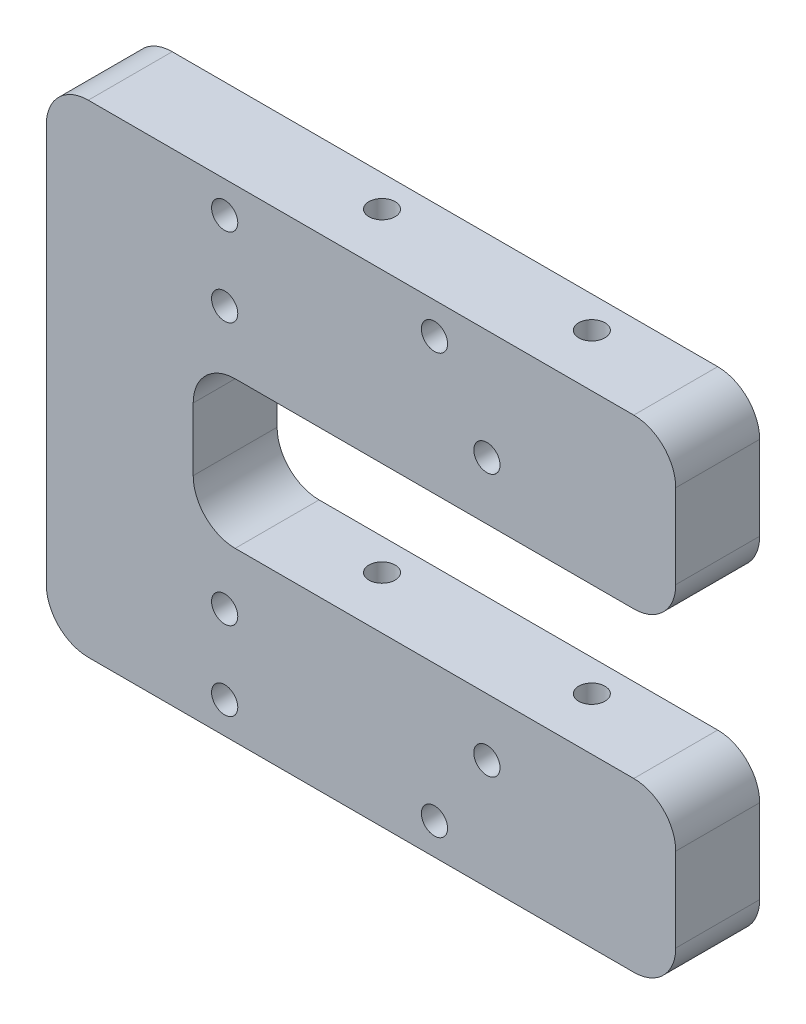
ISO-10303-21;
HEADER;
FILE_DESCRIPTION(('STEP AP214'),'2;1');
FILE_NAME('part.step','',(''),(''),'','','');
FILE_SCHEMA(('AUTOMOTIVE_DESIGN { 1 0 10303 214 1 1 1 1 }'));
ENDSEC;
DATA;
#1=APPLICATION_CONTEXT('core data for automotive mechanical design processes');
#2=APPLICATION_PROTOCOL_DEFINITION('international standard','automotive_design',2000,#1);
#3=PRODUCT_CONTEXT('',#1,'mechanical');
#4=PRODUCT('Part','Part','',(#3));
#5=PRODUCT_RELATED_PRODUCT_CATEGORY('part','',(#4));
#6=PRODUCT_DEFINITION_FORMATION('','',#4);
#7=PRODUCT_DEFINITION_CONTEXT('part definition',#1,'design');
#8=PRODUCT_DEFINITION('design','',#6,#7);
#9=PRODUCT_DEFINITION_SHAPE('','',#8);
#10=(LENGTH_UNIT() NAMED_UNIT(*) SI_UNIT(.MILLI.,.METRE.));
#11=(NAMED_UNIT(*) PLANE_ANGLE_UNIT() SI_UNIT($,.RADIAN.));
#12=(NAMED_UNIT(*) SI_UNIT($,.STERADIAN.) SOLID_ANGLE_UNIT());
#13=UNCERTAINTY_MEASURE_WITH_UNIT(LENGTH_MEASURE(1.E-05),#10,'distance_accuracy_value','');
#14=(GEOMETRIC_REPRESENTATION_CONTEXT(3) GLOBAL_UNCERTAINTY_ASSIGNED_CONTEXT((#13)) GLOBAL_UNIT_ASSIGNED_CONTEXT((#10,
#11,#12)) REPRESENTATION_CONTEXT('',''));
#15=CARTESIAN_POINT('',(0.,0.,0.));
#16=DIRECTION('',(0.,0.,1.));
#17=DIRECTION('',(1.,0.,0.));
#18=AXIS2_PLACEMENT_3D('',#15,#16,#17);
#19=CARTESIAN_POINT('',(0.,0.,8.));
#20=DIRECTION('',(-1.,0.,0.));
#21=DIRECTION('',(0.,0.,1.));
#22=AXIS2_PLACEMENT_3D('',#19,#20,#21);
#23=PLANE('',#22);
#24=DIRECTION('',(0.,1.,0.));
#25=VECTOR('',#24,1.);
#26=CARTESIAN_POINT('',(0.,0.,8.));
#27=LINE('',#26,#25);
#28=CARTESIAN_POINT('',(0.,4.,8.));
#29=VERTEX_POINT('',#28);
#30=CARTESIAN_POINT('',(0.,42.,8.));
#31=VERTEX_POINT('',#30);
#32=EDGE_CURVE('E304',#29,#31,#27,.T.);
#33=ORIENTED_EDGE('',*,*,#32,.T.);
#34=DIRECTION('',(0.,0.,-1.));
#35=VECTOR('',#34,1.);
#36=CARTESIAN_POINT('',(0.,42.,8.));
#37=LINE('',#36,#35);
#38=CARTESIAN_POINT('',(0.,42.,0.));
#39=VERTEX_POINT('',#38);
#40=EDGE_CURVE('E179',#31,#39,#37,.T.);
#41=ORIENTED_EDGE('',*,*,#40,.T.);
#42=DIRECTION('',(0.,1.,0.));
#43=VECTOR('',#42,1.);
#44=CARTESIAN_POINT('',(0.,0.,0.));
#45=LINE('',#44,#43);
#46=CARTESIAN_POINT('',(0.,4.,0.));
#47=VERTEX_POINT('',#46);
#48=EDGE_CURVE('E163',#47,#39,#45,.T.);
#49=ORIENTED_EDGE('',*,*,#48,.F.);
#50=DIRECTION('',(0.,0.,-1.));
#51=VECTOR('',#50,1.);
#52=CARTESIAN_POINT('',(0.,4.,8.));
#53=LINE('',#52,#51);
#54=EDGE_CURVE('E176',#47,#29,#53,.F.);
#55=ORIENTED_EDGE('',*,*,#54,.T.);
#56=EDGE_LOOP('',(#33,#41,#49,#55));
#57=FACE_BOUND('',#56,.T.);
#58=ADVANCED_FACE('F43',(#57),#23,.T.);
#59=CARTESIAN_POINT('',(0.,0.,8.));
#60=DIRECTION('',(0.,1.,0.));
#61=DIRECTION('',(0.,0.,1.));
#62=AXIS2_PLACEMENT_3D('',#59,#60,#61);
#63=PLANE('',#62);
#64=CARTESIAN_POINT('',(27.,0.,3.));
#65=DIRECTION('',(0.,1.,0.));
#66=DIRECTION('',(0.,0.,1.));
#67=AXIS2_PLACEMENT_3D('',#64,#65,#66);
#68=CIRCLE('',#67,1.25);
#69=CARTESIAN_POINT('',(27.,0.,4.25));
#70=VERTEX_POINT('',#69);
#71=EDGE_CURVE('E696',#70,#70,#68,.T.);
#72=ORIENTED_EDGE('',*,*,#71,.T.);
#73=EDGE_LOOP('',(#72));
#74=FACE_BOUND('',#73,.T.);
#75=CARTESIAN_POINT('',(47.,0.,3.));
#76=DIRECTION('',(0.,1.,0.));
#77=DIRECTION('',(0.,0.,1.));
#78=AXIS2_PLACEMENT_3D('',#75,#76,#77);
#79=CIRCLE('',#78,1.25);
#80=CARTESIAN_POINT('',(47.,0.,4.25));
#81=VERTEX_POINT('',#80);
#82=EDGE_CURVE('E703',#81,#81,#79,.T.);
#83=ORIENTED_EDGE('',*,*,#82,.T.);
#84=EDGE_LOOP('',(#83));
#85=FACE_BOUND('',#84,.T.);
#86=DIRECTION('',(1.,0.,0.));
#87=VECTOR('',#86,1.);
#88=CARTESIAN_POINT('',(0.,0.,8.));
#89=LINE('',#88,#87);
#90=CARTESIAN_POINT('',(4.,0.,8.));
#91=VERTEX_POINT('',#90);
#92=CARTESIAN_POINT('',(56.,0.,8.));
#93=VERTEX_POINT('',#92);
#94=EDGE_CURVE('E310',#91,#93,#89,.T.);
#95=ORIENTED_EDGE('',*,*,#94,.F.);
#96=DIRECTION('',(0.,0.,-1.));
#97=VECTOR('',#96,1.);
#98=CARTESIAN_POINT('',(4.,0.,0.));
#99=LINE('',#98,#97);
#100=CARTESIAN_POINT('',(4.,0.,0.));
#101=VERTEX_POINT('',#100);
#102=EDGE_CURVE('E244',#91,#101,#99,.T.);
#103=ORIENTED_EDGE('',*,*,#102,.T.);
#104=DIRECTION('',(1.,0.,0.));
#105=VECTOR('',#104,1.);
#106=CARTESIAN_POINT('',(0.,0.,0.));
#107=LINE('',#106,#105);
#108=CARTESIAN_POINT('',(56.,0.,0.));
#109=VERTEX_POINT('',#108);
#110=EDGE_CURVE('E165',#101,#109,#107,.T.);
#111=ORIENTED_EDGE('',*,*,#110,.T.);
#112=DIRECTION('',(0.,0.,-1.));
#113=VECTOR('',#112,1.);
#114=CARTESIAN_POINT('',(56.,0.,8.));
#115=LINE('',#114,#113);
#116=EDGE_CURVE('E242',#109,#93,#115,.F.);
#117=ORIENTED_EDGE('',*,*,#116,.T.);
#118=EDGE_LOOP('',(#95,#103,#111,#117));
#119=FACE_BOUND('',#118,.T.);
#120=ADVANCED_FACE('F351',(#74,#85,#119),#63,.F.);
#121=CARTESIAN_POINT('',(60.,0.,8.));
#122=DIRECTION('',(-1.,0.,0.));
#123=DIRECTION('',(0.,0.,1.));
#124=AXIS2_PLACEMENT_3D('',#121,#122,#123);
#125=PLANE('',#124);
#126=DIRECTION('',(0.,1.,0.));
#127=VECTOR('',#126,1.);
#128=CARTESIAN_POINT('',(60.,0.,0.));
#129=LINE('',#128,#127);
#130=CARTESIAN_POINT('',(60.,4.,0.));
#131=VERTEX_POINT('',#130);
#132=CARTESIAN_POINT('',(60.,12.,0.));
#133=VERTEX_POINT('',#132);
#134=EDGE_CURVE('E274',#131,#133,#129,.T.);
#135=ORIENTED_EDGE('',*,*,#134,.T.);
#136=DIRECTION('',(0.,0.,-1.));
#137=VECTOR('',#136,1.);
#138=CARTESIAN_POINT('',(60.,12.,8.));
#139=LINE('',#138,#137);
#140=CARTESIAN_POINT('',(60.,12.,8.));
#141=VERTEX_POINT('',#140);
#142=EDGE_CURVE('E240',#133,#141,#139,.F.);
#143=ORIENTED_EDGE('',*,*,#142,.T.);
#144=DIRECTION('',(0.,1.,0.));
#145=VECTOR('',#144,1.);
#146=CARTESIAN_POINT('',(60.,0.,8.));
#147=LINE('',#146,#145);
#148=CARTESIAN_POINT('',(60.,4.,8.));
#149=VERTEX_POINT('',#148);
#150=EDGE_CURVE('E313',#149,#141,#147,.T.);
#151=ORIENTED_EDGE('',*,*,#150,.F.);
#152=DIRECTION('',(0.,0.,-1.));
#153=VECTOR('',#152,1.);
#154=CARTESIAN_POINT('',(60.,4.,8.));
#155=LINE('',#154,#153);
#156=EDGE_CURVE('E237',#149,#131,#155,.T.);
#157=ORIENTED_EDGE('',*,*,#156,.T.);
#158=EDGE_LOOP('',(#135,#143,#151,#157));
#159=FACE_BOUND('',#158,.T.);
#160=ADVANCED_FACE('F358',(#159),#125,.F.);
#161=CARTESIAN_POINT('',(0.,16.,8.));
#162=DIRECTION('',(0.,1.,0.));
#163=DIRECTION('',(0.,0.,1.));
#164=AXIS2_PLACEMENT_3D('',#161,#162,#163);
#165=PLANE('',#164);
#166=CARTESIAN_POINT('',(27.,16.,3.));
#167=DIRECTION('',(0.,1.,0.));
#168=DIRECTION('',(0.,0.,1.));
#169=AXIS2_PLACEMENT_3D('',#166,#167,#168);
#170=CIRCLE('',#169,1.25);
#171=CARTESIAN_POINT('',(27.,16.,4.25));
#172=VERTEX_POINT('',#171);
#173=EDGE_CURVE('E699',#172,#172,#170,.T.);
#174=ORIENTED_EDGE('',*,*,#173,.F.);
#175=EDGE_LOOP('',(#174));
#176=FACE_BOUND('',#175,.T.);
#177=CARTESIAN_POINT('',(47.,16.,3.));
#178=DIRECTION('',(0.,1.,0.));
#179=DIRECTION('',(0.,0.,1.));
#180=AXIS2_PLACEMENT_3D('',#177,#178,#179);
#181=CIRCLE('',#180,1.25);
#182=CARTESIAN_POINT('',(47.,16.,4.25));
#183=VERTEX_POINT('',#182);
#184=EDGE_CURVE('E708',#183,#183,#181,.T.);
#185=ORIENTED_EDGE('',*,*,#184,.F.);
#186=EDGE_LOOP('',(#185));
#187=FACE_BOUND('',#186,.T.);
#188=DIRECTION('',(1.,0.,0.));
#189=VECTOR('',#188,1.);
#190=CARTESIAN_POINT('',(0.,16.,0.));
#191=LINE('',#190,#189);
#192=CARTESIAN_POINT('',(18.,16.,0.));
#193=VERTEX_POINT('',#192);
#194=CARTESIAN_POINT('',(56.,16.,0.));
#195=VERTEX_POINT('',#194);
#196=EDGE_CURVE('E277',#193,#195,#191,.T.);
#197=ORIENTED_EDGE('',*,*,#196,.F.);
#198=DIRECTION('',(0.,0.,-1.));
#199=VECTOR('',#198,1.);
#200=CARTESIAN_POINT('',(18.,16.,8.));
#201=LINE('',#200,#199);
#202=CARTESIAN_POINT('',(18.,16.,8.));
#203=VERTEX_POINT('',#202);
#204=EDGE_CURVE('E235',#193,#203,#201,.F.);
#205=ORIENTED_EDGE('',*,*,#204,.T.);
#206=DIRECTION('',(1.,0.,0.));
#207=VECTOR('',#206,1.);
#208=CARTESIAN_POINT('',(0.,16.,8.));
#209=LINE('',#208,#207);
#210=CARTESIAN_POINT('',(56.,16.,8.));
#211=VERTEX_POINT('',#210);
#212=EDGE_CURVE('E316',#203,#211,#209,.T.);
#213=ORIENTED_EDGE('',*,*,#212,.T.);
#214=DIRECTION('',(0.,0.,-1.));
#215=VECTOR('',#214,1.);
#216=CARTESIAN_POINT('',(56.,16.,0.));
#217=LINE('',#216,#215);
#218=EDGE_CURVE('E232',#211,#195,#217,.T.);
#219=ORIENTED_EDGE('',*,*,#218,.T.);
#220=EDGE_LOOP('',(#197,#205,#213,#219));
#221=FACE_BOUND('',#220,.T.);
#222=ADVANCED_FACE('F420',(#176,#187,#221),#165,.T.);
#223=CARTESIAN_POINT('',(14.,0.,8.));
#224=DIRECTION('',(-1.,0.,0.));
#225=DIRECTION('',(0.,0.,1.));
#226=AXIS2_PLACEMENT_3D('',#223,#224,#225);
#227=PLANE('',#226);
#228=DIRECTION('',(0.,1.,0.));
#229=VECTOR('',#228,1.);
#230=CARTESIAN_POINT('',(14.,0.,0.));
#231=LINE('',#230,#229);
#232=CARTESIAN_POINT('',(14.,20.,0.));
#233=VERTEX_POINT('',#232);
#234=CARTESIAN_POINT('',(14.,26.,0.));
#235=VERTEX_POINT('',#234);
#236=EDGE_CURVE('E280',#233,#235,#231,.T.);
#237=ORIENTED_EDGE('',*,*,#236,.T.);
#238=DIRECTION('',(0.,0.,-1.));
#239=VECTOR('',#238,1.);
#240=CARTESIAN_POINT('',(14.,26.,8.));
#241=LINE('',#240,#239);
#242=CARTESIAN_POINT('',(14.,26.,8.));
#243=VERTEX_POINT('',#242);
#244=EDGE_CURVE('E230',#235,#243,#241,.F.);
#245=ORIENTED_EDGE('',*,*,#244,.T.);
#246=DIRECTION('',(0.,1.,0.));
#247=VECTOR('',#246,1.);
#248=CARTESIAN_POINT('',(14.,0.,8.));
#249=LINE('',#248,#247);
#250=CARTESIAN_POINT('',(14.,20.,8.));
#251=VERTEX_POINT('',#250);
#252=EDGE_CURVE('E319',#251,#243,#249,.T.);
#253=ORIENTED_EDGE('',*,*,#252,.F.);
#254=DIRECTION('',(0.,0.,-1.));
#255=VECTOR('',#254,1.);
#256=CARTESIAN_POINT('',(14.,20.,8.));
#257=LINE('',#256,#255);
#258=EDGE_CURVE('E227',#251,#233,#257,.T.);
#259=ORIENTED_EDGE('',*,*,#258,.T.);
#260=EDGE_LOOP('',(#237,#245,#253,#259));
#261=FACE_BOUND('',#260,.T.);
#262=ADVANCED_FACE('F426',(#261),#227,.F.);
#263=CARTESIAN_POINT('',(0.,30.,8.));
#264=DIRECTION('',(0.,1.,0.));
#265=DIRECTION('',(0.,0.,1.));
#266=AXIS2_PLACEMENT_3D('',#263,#264,#265);
#267=PLANE('',#266);
#268=CARTESIAN_POINT('',(27.,30.,3.));
#269=DIRECTION('',(0.,1.,0.));
#270=DIRECTION('',(0.,0.,1.));
#271=AXIS2_PLACEMENT_3D('',#268,#269,#270);
#272=CIRCLE('',#271,1.25);
#273=CARTESIAN_POINT('',(27.,30.,4.25));
#274=VERTEX_POINT('',#273);
#275=EDGE_CURVE('E701',#274,#274,#272,.T.);
#276=ORIENTED_EDGE('',*,*,#275,.T.);
#277=EDGE_LOOP('',(#276));
#278=FACE_BOUND('',#277,.T.);
#279=CARTESIAN_POINT('',(47.,30.,3.));
#280=DIRECTION('',(0.,1.,0.));
#281=DIRECTION('',(0.,0.,1.));
#282=AXIS2_PLACEMENT_3D('',#279,#280,#281);
#283=CIRCLE('',#282,1.25);
#284=CARTESIAN_POINT('',(47.,30.,4.25));
#285=VERTEX_POINT('',#284);
#286=EDGE_CURVE('E711',#285,#285,#283,.T.);
#287=ORIENTED_EDGE('',*,*,#286,.T.);
#288=EDGE_LOOP('',(#287));
#289=FACE_BOUND('',#288,.T.);
#290=DIRECTION('',(1.,0.,0.));
#291=VECTOR('',#290,1.);
#292=CARTESIAN_POINT('',(0.,30.,0.));
#293=LINE('',#292,#291);
#294=CARTESIAN_POINT('',(18.,30.,0.));
#295=VERTEX_POINT('',#294);
#296=CARTESIAN_POINT('',(56.,30.,0.));
#297=VERTEX_POINT('',#296);
#298=EDGE_CURVE('E283',#295,#297,#293,.T.);
#299=ORIENTED_EDGE('',*,*,#298,.T.);
#300=DIRECTION('',(0.,0.,-1.));
#301=VECTOR('',#300,1.);
#302=CARTESIAN_POINT('',(56.,30.,8.));
#303=LINE('',#302,#301);
#304=CARTESIAN_POINT('',(56.,30.,8.));
#305=VERTEX_POINT('',#304);
#306=EDGE_CURVE('E225',#297,#305,#303,.F.);
#307=ORIENTED_EDGE('',*,*,#306,.T.);
#308=DIRECTION('',(1.,0.,0.));
#309=VECTOR('',#308,1.);
#310=CARTESIAN_POINT('',(0.,30.,8.));
#311=LINE('',#310,#309);
#312=CARTESIAN_POINT('',(18.,30.,8.));
#313=VERTEX_POINT('',#312);
#314=EDGE_CURVE('E322',#313,#305,#311,.T.);
#315=ORIENTED_EDGE('',*,*,#314,.F.);
#316=DIRECTION('',(0.,0.,-1.));
#317=VECTOR('',#316,1.);
#318=CARTESIAN_POINT('',(18.,30.,0.));
#319=LINE('',#318,#317);
#320=EDGE_CURVE('E222',#313,#295,#319,.T.);
#321=ORIENTED_EDGE('',*,*,#320,.T.);
#322=EDGE_LOOP('',(#299,#307,#315,#321));
#323=FACE_BOUND('',#322,.T.);
#324=ADVANCED_FACE('F347',(#278,#289,#323),#267,.F.);
#325=CARTESIAN_POINT('',(60.,0.,8.));
#326=DIRECTION('',(-1.,0.,0.));
#327=DIRECTION('',(0.,0.,1.));
#328=AXIS2_PLACEMENT_3D('',#325,#326,#327);
#329=PLANE('',#328);
#330=DIRECTION('',(0.,1.,0.));
#331=VECTOR('',#330,1.);
#332=CARTESIAN_POINT('',(60.,0.,0.));
#333=LINE('',#332,#331);
#334=CARTESIAN_POINT('',(60.,34.,0.));
#335=VERTEX_POINT('',#334);
#336=CARTESIAN_POINT('',(60.,42.,0.));
#337=VERTEX_POINT('',#336);
#338=EDGE_CURVE('E286',#335,#337,#333,.T.);
#339=ORIENTED_EDGE('',*,*,#338,.T.);
#340=DIRECTION('',(0.,0.,-1.));
#341=VECTOR('',#340,1.);
#342=CARTESIAN_POINT('',(60.,42.,8.));
#343=LINE('',#342,#341);
#344=CARTESIAN_POINT('',(60.,42.,8.));
#345=VERTEX_POINT('',#344);
#346=EDGE_CURVE('E60',#337,#345,#343,.F.);
#347=ORIENTED_EDGE('',*,*,#346,.T.);
#348=DIRECTION('',(0.,1.,0.));
#349=VECTOR('',#348,1.);
#350=CARTESIAN_POINT('',(60.,0.,8.));
#351=LINE('',#350,#349);
#352=CARTESIAN_POINT('',(60.,34.,8.));
#353=VERTEX_POINT('',#352);
#354=EDGE_CURVE('E324',#353,#345,#351,.T.);
#355=ORIENTED_EDGE('',*,*,#354,.F.);
#356=DIRECTION('',(0.,0.,-1.));
#357=VECTOR('',#356,1.);
#358=CARTESIAN_POINT('',(60.,34.,8.));
#359=LINE('',#358,#357);
#360=EDGE_CURVE('E218',#353,#335,#359,.T.);
#361=ORIENTED_EDGE('',*,*,#360,.T.);
#362=EDGE_LOOP('',(#339,#347,#355,#361));
#363=FACE_BOUND('',#362,.T.);
#364=ADVANCED_FACE('F337',(#363),#329,.F.);
#365=CARTESIAN_POINT('',(42.,10.5,8.));
#366=DIRECTION('',(0.,0.,-1.));
#367=DIRECTION('',(-1.,0.,0.));
#368=AXIS2_PLACEMENT_3D('',#365,#366,#367);
#369=CYLINDRICAL_SURFACE('',#368,1.25);
#370=CARTESIAN_POINT('',(42.,10.5,8.));
#371=DIRECTION('',(0.,0.,1.));
#372=DIRECTION('',(1.,0.,0.));
#373=AXIS2_PLACEMENT_3D('',#370,#371,#372);
#374=CIRCLE('',#373,1.25);
#375=CARTESIAN_POINT('',(43.25,10.5,8.));
#376=VERTEX_POINT('',#375);
#377=EDGE_CURVE('E189',#376,#376,#374,.F.);
#378=ORIENTED_EDGE('',*,*,#377,.F.);
#379=EDGE_LOOP('',(#378));
#380=FACE_BOUND('',#379,.T.);
#381=CARTESIAN_POINT('',(42.,10.5,0.));
#382=DIRECTION('',(0.,0.,1.));
#383=DIRECTION('',(1.,0.,0.));
#384=AXIS2_PLACEMENT_3D('',#381,#382,#383);
#385=CIRCLE('',#384,1.25);
#386=CARTESIAN_POINT('',(43.25,10.5,0.));
#387=VERTEX_POINT('',#386);
#388=EDGE_CURVE('E290',#387,#387,#385,.F.);
#389=ORIENTED_EDGE('',*,*,#388,.T.);
#390=EDGE_LOOP('',(#389));
#391=FACE_BOUND('',#390,.T.);
#392=ADVANCED_FACE('F334',(#380,#391),#369,.F.);
#393=CARTESIAN_POINT('',(0.,46.,8.));
#394=DIRECTION('',(0.,1.,0.));
#395=DIRECTION('',(0.,0.,1.));
#396=AXIS2_PLACEMENT_3D('',#393,#394,#395);
#397=PLANE('',#396);
#398=CARTESIAN_POINT('',(27.,46.,3.));
#399=DIRECTION('',(0.,1.,0.));
#400=DIRECTION('',(0.,0.,1.));
#401=AXIS2_PLACEMENT_3D('',#398,#399,#400);
#402=CIRCLE('',#401,1.25);
#403=CARTESIAN_POINT('',(27.,46.,4.25));
#404=VERTEX_POINT('',#403);
#405=EDGE_CURVE('E714',#404,#404,#402,.T.);
#406=ORIENTED_EDGE('',*,*,#405,.F.);
#407=EDGE_LOOP('',(#406));
#408=FACE_BOUND('',#407,.T.);
#409=CARTESIAN_POINT('',(47.,46.,3.));
#410=DIRECTION('',(0.,1.,0.));
#411=DIRECTION('',(0.,0.,1.));
#412=AXIS2_PLACEMENT_3D('',#409,#410,#411);
#413=CIRCLE('',#412,1.25);
#414=CARTESIAN_POINT('',(47.,46.,4.25));
#415=VERTEX_POINT('',#414);
#416=EDGE_CURVE('E715',#415,#415,#413,.T.);
#417=ORIENTED_EDGE('',*,*,#416,.F.);
#418=EDGE_LOOP('',(#417));
#419=FACE_BOUND('',#418,.T.);
#420=DIRECTION('',(1.,0.,0.));
#421=VECTOR('',#420,1.);
#422=CARTESIAN_POINT('',(0.,46.,0.));
#423=LINE('',#422,#421);
#424=CARTESIAN_POINT('',(4.,46.,0.));
#425=VERTEX_POINT('',#424);
#426=CARTESIAN_POINT('',(56.,46.,0.));
#427=VERTEX_POINT('',#426);
#428=EDGE_CURVE('E288',#425,#427,#423,.T.);
#429=ORIENTED_EDGE('',*,*,#428,.F.);
#430=DIRECTION('',(0.,0.,-1.));
#431=VECTOR('',#430,1.);
#432=CARTESIAN_POINT('',(4.,46.,8.));
#433=LINE('',#432,#431);
#434=CARTESIAN_POINT('',(4.,46.,8.));
#435=VERTEX_POINT('',#434);
#436=EDGE_CURVE('E206',#425,#435,#433,.F.);
#437=ORIENTED_EDGE('',*,*,#436,.T.);
#438=DIRECTION('',(1.,0.,0.));
#439=VECTOR('',#438,1.);
#440=CARTESIAN_POINT('',(0.,46.,8.));
#441=LINE('',#440,#439);
#442=CARTESIAN_POINT('',(56.,46.,8.));
#443=VERTEX_POINT('',#442);
#444=EDGE_CURVE('E326',#435,#443,#441,.T.);
#445=ORIENTED_EDGE('',*,*,#444,.T.);
#446=DIRECTION('',(0.,0.,-1.));
#447=VECTOR('',#446,1.);
#448=CARTESIAN_POINT('',(56.,46.,0.));
#449=LINE('',#448,#447);
#450=EDGE_CURVE('E203',#443,#427,#449,.T.);
#451=ORIENTED_EDGE('',*,*,#450,.T.);
#452=EDGE_LOOP('',(#429,#437,#445,#451));
#453=FACE_BOUND('',#452,.T.);
#454=ADVANCED_FACE('F336',(#408,#419,#453),#397,.T.);
#455=CARTESIAN_POINT('',(42.,35.5,8.));
#456=DIRECTION('',(0.,0.,-1.));
#457=DIRECTION('',(-1.,0.,0.));
#458=AXIS2_PLACEMENT_3D('',#455,#456,#457);
#459=CYLINDRICAL_SURFACE('',#458,1.25);
#460=CARTESIAN_POINT('',(42.,35.5,8.));
#461=DIRECTION('',(0.,0.,1.));
#462=DIRECTION('',(1.,0.,0.));
#463=AXIS2_PLACEMENT_3D('',#460,#461,#462);
#464=CIRCLE('',#463,1.25);
#465=CARTESIAN_POINT('',(43.25,35.5,8.));
#466=VERTEX_POINT('',#465);
#467=EDGE_CURVE('E299',#466,#466,#464,.T.);
#468=ORIENTED_EDGE('',*,*,#467,.T.);
#469=EDGE_LOOP('',(#468));
#470=FACE_BOUND('',#469,.T.);
#471=CARTESIAN_POINT('',(42.,35.5,0.));
#472=DIRECTION('',(0.,0.,1.));
#473=DIRECTION('',(1.,0.,0.));
#474=AXIS2_PLACEMENT_3D('',#471,#472,#473);
#475=CIRCLE('',#474,1.25);
#476=CARTESIAN_POINT('',(43.25,35.5,0.));
#477=VERTEX_POINT('',#476);
#478=EDGE_CURVE('E180',#477,#477,#475,.T.);
#479=ORIENTED_EDGE('',*,*,#478,.F.);
#480=EDGE_LOOP('',(#479));
#481=FACE_BOUND('',#480,.T.);
#482=ADVANCED_FACE('F343',(#470,#481),#459,.F.);
#483=CARTESIAN_POINT('',(17.,35.5,8.));
#484=DIRECTION('',(0.,0.,-1.));
#485=DIRECTION('',(-1.,0.,0.));
#486=AXIS2_PLACEMENT_3D('',#483,#484,#485);
#487=CYLINDRICAL_SURFACE('',#486,1.25);
#488=CARTESIAN_POINT('',(17.,35.5,8.));
#489=DIRECTION('',(0.,0.,1.));
#490=DIRECTION('',(1.,0.,0.));
#491=AXIS2_PLACEMENT_3D('',#488,#489,#490);
#492=CIRCLE('',#491,1.25);
#493=CARTESIAN_POINT('',(18.25,35.5,8.));
#494=VERTEX_POINT('',#493);
#495=EDGE_CURVE('E295',#494,#494,#492,.T.);
#496=ORIENTED_EDGE('',*,*,#495,.T.);
#497=EDGE_LOOP('',(#496));
#498=FACE_BOUND('',#497,.T.);
#499=CARTESIAN_POINT('',(17.,35.5,0.));
#500=DIRECTION('',(0.,0.,1.));
#501=DIRECTION('',(1.,0.,0.));
#502=AXIS2_PLACEMENT_3D('',#499,#500,#501);
#503=CIRCLE('',#502,1.25);
#504=CARTESIAN_POINT('',(18.25,35.5,0.));
#505=VERTEX_POINT('',#504);
#506=EDGE_CURVE('E262',#505,#505,#503,.T.);
#507=ORIENTED_EDGE('',*,*,#506,.F.);
#508=EDGE_LOOP('',(#507));
#509=FACE_BOUND('',#508,.T.);
#510=ADVANCED_FACE('F364',(#498,#509),#487,.F.);
#511=CARTESIAN_POINT('',(17.,10.5,8.));
#512=DIRECTION('',(0.,0.,-1.));
#513=DIRECTION('',(-1.,0.,0.));
#514=AXIS2_PLACEMENT_3D('',#511,#512,#513);
#515=CYLINDRICAL_SURFACE('',#514,1.25);
#516=CARTESIAN_POINT('',(17.,10.5,8.));
#517=DIRECTION('',(0.,0.,1.));
#518=DIRECTION('',(1.,0.,0.));
#519=AXIS2_PLACEMENT_3D('',#516,#517,#518);
#520=CIRCLE('',#519,1.25);
#521=CARTESIAN_POINT('',(18.25,10.5,8.));
#522=VERTEX_POINT('',#521);
#523=EDGE_CURVE('E185',#522,#522,#520,.F.);
#524=ORIENTED_EDGE('',*,*,#523,.F.);
#525=EDGE_LOOP('',(#524));
#526=FACE_BOUND('',#525,.T.);
#527=CARTESIAN_POINT('',(17.,10.5,0.));
#528=DIRECTION('',(0.,0.,1.));
#529=DIRECTION('',(1.,0.,0.));
#530=AXIS2_PLACEMENT_3D('',#527,#528,#529);
#531=CIRCLE('',#530,1.25);
#532=CARTESIAN_POINT('',(18.25,10.5,0.));
#533=VERTEX_POINT('',#532);
#534=EDGE_CURVE('E192',#533,#533,#531,.F.);
#535=ORIENTED_EDGE('',*,*,#534,.T.);
#536=EDGE_LOOP('',(#535));
#537=FACE_BOUND('',#536,.T.);
#538=ADVANCED_FACE('F368',(#526,#537),#515,.F.);
#539=CARTESIAN_POINT('',(0.,0.,8.));
#540=DIRECTION('',(0.,0.,1.));
#541=DIRECTION('',(1.,0.,0.));
#542=AXIS2_PLACEMENT_3D('',#539,#540,#541);
#543=PLANE('',#542);
#544=CARTESIAN_POINT('',(17.,43.,8.));
#545=DIRECTION('',(0.,0.,1.));
#546=DIRECTION('',(-1.,0.,0.));
#547=AXIS2_PLACEMENT_3D('',#544,#545,#546);
#548=CIRCLE('',#547,1.25);
#549=CARTESIAN_POINT('',(15.75,43.,8.));
#550=VERTEX_POINT('',#549);
#551=EDGE_CURVE('E679',#550,#550,#548,.T.);
#552=ORIENTED_EDGE('',*,*,#551,.F.);
#553=EDGE_LOOP('',(#552));
#554=FACE_BOUND('',#553,.T.);
#555=CARTESIAN_POINT('',(37.,43.,8.));
#556=DIRECTION('',(0.,0.,1.));
#557=DIRECTION('',(-1.,0.,0.));
#558=AXIS2_PLACEMENT_3D('',#555,#556,#557);
#559=CIRCLE('',#558,1.25);
#560=CARTESIAN_POINT('',(35.75,43.,8.));
#561=VERTEX_POINT('',#560);
#562=EDGE_CURVE('E683',#561,#561,#559,.T.);
#563=ORIENTED_EDGE('',*,*,#562,.F.);
#564=EDGE_LOOP('',(#563));
#565=FACE_BOUND('',#564,.T.);
#566=CARTESIAN_POINT('',(37.,3.,8.));
#567=DIRECTION('',(0.,0.,1.));
#568=DIRECTION('',(1.,0.,0.));
#569=AXIS2_PLACEMENT_3D('',#566,#567,#568);
#570=CIRCLE('',#569,1.25);
#571=CARTESIAN_POINT('',(38.25,3.,8.));
#572=VERTEX_POINT('',#571);
#573=EDGE_CURVE('E687',#572,#572,#570,.T.);
#574=ORIENTED_EDGE('',*,*,#573,.F.);
#575=EDGE_LOOP('',(#574));
#576=FACE_BOUND('',#575,.T.);
#577=CARTESIAN_POINT('',(17.,3.,8.));
#578=DIRECTION('',(0.,0.,1.));
#579=DIRECTION('',(1.,0.,0.));
#580=AXIS2_PLACEMENT_3D('',#577,#578,#579);
#581=CIRCLE('',#580,1.25);
#582=CARTESIAN_POINT('',(18.25,3.,8.));
#583=VERTEX_POINT('',#582);
#584=EDGE_CURVE('E255',#583,#583,#581,.T.);
#585=ORIENTED_EDGE('',*,*,#584,.F.);
#586=EDGE_LOOP('',(#585));
#587=FACE_BOUND('',#586,.T.);
#588=ORIENTED_EDGE('',*,*,#495,.F.);
#589=EDGE_LOOP('',(#588));
#590=FACE_BOUND('',#589,.T.);
#591=ORIENTED_EDGE('',*,*,#467,.F.);
#592=EDGE_LOOP('',(#591));
#593=FACE_BOUND('',#592,.T.);
#594=ORIENTED_EDGE('',*,*,#444,.F.);
#595=CARTESIAN_POINT('',(4.,42.,8.));
#596=DIRECTION('',(0.,0.,1.));
#597=DIRECTION('',(1.,0.,0.));
#598=AXIS2_PLACEMENT_3D('',#595,#596,#597);
#599=CIRCLE('',#598,4.);
#600=EDGE_CURVE('E216',#435,#31,#599,.T.);
#601=ORIENTED_EDGE('',*,*,#600,.T.);
#602=ORIENTED_EDGE('',*,*,#32,.F.);
#603=CARTESIAN_POINT('',(4.,4.,8.));
#604=DIRECTION('',(0.,0.,1.));
#605=DIRECTION('',(1.,0.,0.));
#606=AXIS2_PLACEMENT_3D('',#603,#604,#605);
#607=CIRCLE('',#606,4.);
#608=EDGE_CURVE('E184',#29,#91,#607,.T.);
#609=ORIENTED_EDGE('',*,*,#608,.T.);
#610=ORIENTED_EDGE('',*,*,#94,.T.);
#611=CARTESIAN_POINT('',(56.,4.,8.));
#612=DIRECTION('',(0.,0.,1.));
#613=DIRECTION('',(1.,0.,0.));
#614=AXIS2_PLACEMENT_3D('',#611,#612,#613);
#615=CIRCLE('',#614,4.);
#616=EDGE_CURVE('E208',#93,#149,#615,.T.);
#617=ORIENTED_EDGE('',*,*,#616,.T.);
#618=ORIENTED_EDGE('',*,*,#150,.T.);
#619=CARTESIAN_POINT('',(56.,12.,8.));
#620=DIRECTION('',(0.,0.,1.));
#621=DIRECTION('',(1.,0.,0.));
#622=AXIS2_PLACEMENT_3D('',#619,#620,#621);
#623=CIRCLE('',#622,4.);
#624=EDGE_CURVE('E211',#141,#211,#623,.T.);
#625=ORIENTED_EDGE('',*,*,#624,.T.);
#626=ORIENTED_EDGE('',*,*,#212,.F.);
#627=CARTESIAN_POINT('',(18.,20.,8.));
#628=DIRECTION('',(0.,0.,1.));
#629=DIRECTION('',(1.,0.,0.));
#630=AXIS2_PLACEMENT_3D('',#627,#628,#629);
#631=CIRCLE('',#630,4.);
#632=EDGE_CURVE('E11',#203,#251,#631,.F.);
#633=ORIENTED_EDGE('',*,*,#632,.T.);
#634=ORIENTED_EDGE('',*,*,#252,.T.);
#635=CARTESIAN_POINT('',(18.,26.,8.));
#636=DIRECTION('',(0.,0.,1.));
#637=DIRECTION('',(1.,0.,0.));
#638=AXIS2_PLACEMENT_3D('',#635,#636,#637);
#639=CIRCLE('',#638,4.);
#640=EDGE_CURVE('E248',#243,#313,#639,.F.);
#641=ORIENTED_EDGE('',*,*,#640,.T.);
#642=ORIENTED_EDGE('',*,*,#314,.T.);
#643=CARTESIAN_POINT('',(56.,34.,8.));
#644=DIRECTION('',(0.,0.,1.));
#645=DIRECTION('',(1.,0.,0.));
#646=AXIS2_PLACEMENT_3D('',#643,#644,#645);
#647=CIRCLE('',#646,4.);
#648=EDGE_CURVE('E67',#305,#353,#647,.T.);
#649=ORIENTED_EDGE('',*,*,#648,.T.);
#650=ORIENTED_EDGE('',*,*,#354,.T.);
#651=CARTESIAN_POINT('',(56.,42.,8.));
#652=DIRECTION('',(0.,0.,1.));
#653=DIRECTION('',(1.,0.,0.));
#654=AXIS2_PLACEMENT_3D('',#651,#652,#653);
#655=CIRCLE('',#654,4.);
#656=EDGE_CURVE('E214',#345,#443,#655,.T.);
#657=ORIENTED_EDGE('',*,*,#656,.T.);
#658=EDGE_LOOP('',(#594,#601,#602,#609,#610,#617,#618,#625,#626,#633,#634,#641,#642,#649,#650,#657));
#659=FACE_BOUND('',#658,.T.);
#660=ORIENTED_EDGE('',*,*,#377,.T.);
#661=EDGE_LOOP('',(#660));
#662=FACE_BOUND('',#661,.T.);
#663=ORIENTED_EDGE('',*,*,#523,.T.);
#664=EDGE_LOOP('',(#663));
#665=FACE_BOUND('',#664,.T.);
#666=ADVANCED_FACE('F331',(#554,#565,#576,#587,#590,#593,#659,#662,#665),#543,.T.);
#667=CARTESIAN_POINT('',(0.,0.,0.));
#668=DIRECTION('',(0.,0.,1.));
#669=DIRECTION('',(1.,0.,0.));
#670=AXIS2_PLACEMENT_3D('',#667,#668,#669);
#671=PLANE('',#670);
#672=CARTESIAN_POINT('',(17.,43.,0.));
#673=DIRECTION('',(0.,0.,1.));
#674=DIRECTION('',(1.,0.,0.));
#675=AXIS2_PLACEMENT_3D('',#672,#673,#674);
#676=CIRCLE('',#675,1.25);
#677=CARTESIAN_POINT('',(18.25,43.,0.));
#678=VERTEX_POINT('',#677);
#679=EDGE_CURVE('E47',#678,#678,#676,.T.);
#680=ORIENTED_EDGE('',*,*,#679,.T.);
#681=EDGE_LOOP('',(#680));
#682=FACE_BOUND('',#681,.T.);
#683=CARTESIAN_POINT('',(37.,43.,0.));
#684=DIRECTION('',(0.,0.,1.));
#685=DIRECTION('',(1.,0.,0.));
#686=AXIS2_PLACEMENT_3D('',#683,#684,#685);
#687=CIRCLE('',#686,1.25);
#688=CARTESIAN_POINT('',(38.25,43.,0.));
#689=VERTEX_POINT('',#688);
#690=EDGE_CURVE('E257',#689,#689,#687,.T.);
#691=ORIENTED_EDGE('',*,*,#690,.T.);
#692=EDGE_LOOP('',(#691));
#693=FACE_BOUND('',#692,.T.);
#694=CARTESIAN_POINT('',(37.,3.,0.));
#695=DIRECTION('',(0.,0.,1.));
#696=DIRECTION('',(1.,0.,0.));
#697=AXIS2_PLACEMENT_3D('',#694,#695,#696);
#698=CIRCLE('',#697,1.25);
#699=CARTESIAN_POINT('',(38.25,3.,0.));
#700=VERTEX_POINT('',#699);
#701=EDGE_CURVE('E254',#700,#700,#698,.T.);
#702=ORIENTED_EDGE('',*,*,#701,.T.);
#703=EDGE_LOOP('',(#702));
#704=FACE_BOUND('',#703,.T.);
#705=CARTESIAN_POINT('',(17.,3.,0.));
#706=DIRECTION('',(0.,0.,1.));
#707=DIRECTION('',(1.,0.,0.));
#708=AXIS2_PLACEMENT_3D('',#705,#706,#707);
#709=CIRCLE('',#708,1.25);
#710=CARTESIAN_POINT('',(18.25,3.,0.));
#711=VERTEX_POINT('',#710);
#712=EDGE_CURVE('E251',#711,#711,#709,.T.);
#713=ORIENTED_EDGE('',*,*,#712,.T.);
#714=EDGE_LOOP('',(#713));
#715=FACE_BOUND('',#714,.T.);
#716=ORIENTED_EDGE('',*,*,#506,.T.);
#717=EDGE_LOOP('',(#716));
#718=FACE_BOUND('',#717,.T.);
#719=ORIENTED_EDGE('',*,*,#478,.T.);
#720=EDGE_LOOP('',(#719));
#721=FACE_BOUND('',#720,.T.);
#722=ORIENTED_EDGE('',*,*,#48,.T.);
#723=CARTESIAN_POINT('',(4.,42.,0.));
#724=DIRECTION('',(0.,0.,1.));
#725=DIRECTION('',(1.,0.,0.));
#726=AXIS2_PLACEMENT_3D('',#723,#724,#725);
#727=CIRCLE('',#726,4.);
#728=EDGE_CURVE('E201',#39,#425,#727,.F.);
#729=ORIENTED_EDGE('',*,*,#728,.T.);
#730=ORIENTED_EDGE('',*,*,#428,.T.);
#731=CARTESIAN_POINT('',(56.,42.,0.));
#732=DIRECTION('',(0.,0.,1.));
#733=DIRECTION('',(1.,0.,0.));
#734=AXIS2_PLACEMENT_3D('',#731,#732,#733);
#735=CIRCLE('',#734,4.);
#736=EDGE_CURVE('E199',#427,#337,#735,.F.);
#737=ORIENTED_EDGE('',*,*,#736,.T.);
#738=ORIENTED_EDGE('',*,*,#338,.F.);
#739=CARTESIAN_POINT('',(56.,34.,0.));
#740=DIRECTION('',(0.,0.,1.));
#741=DIRECTION('',(1.,0.,0.));
#742=AXIS2_PLACEMENT_3D('',#739,#740,#741);
#743=CIRCLE('',#742,4.);
#744=EDGE_CURVE('E197',#335,#297,#743,.F.);
#745=ORIENTED_EDGE('',*,*,#744,.T.);
#746=ORIENTED_EDGE('',*,*,#298,.F.);
#747=CARTESIAN_POINT('',(18.,26.,0.));
#748=DIRECTION('',(0.,0.,1.));
#749=DIRECTION('',(1.,0.,0.));
#750=AXIS2_PLACEMENT_3D('',#747,#748,#749);
#751=CIRCLE('',#750,4.);
#752=EDGE_CURVE('E246',#295,#235,#751,.T.);
#753=ORIENTED_EDGE('',*,*,#752,.T.);
#754=ORIENTED_EDGE('',*,*,#236,.F.);
#755=CARTESIAN_POINT('',(18.,20.,0.));
#756=DIRECTION('',(0.,0.,1.));
#757=DIRECTION('',(1.,0.,0.));
#758=AXIS2_PLACEMENT_3D('',#755,#756,#757);
#759=CIRCLE('',#758,4.);
#760=EDGE_CURVE('E52',#233,#193,#759,.T.);
#761=ORIENTED_EDGE('',*,*,#760,.T.);
#762=ORIENTED_EDGE('',*,*,#196,.T.);
#763=CARTESIAN_POINT('',(56.,12.,0.));
#764=DIRECTION('',(0.,0.,1.));
#765=DIRECTION('',(1.,0.,0.));
#766=AXIS2_PLACEMENT_3D('',#763,#764,#765);
#767=CIRCLE('',#766,4.);
#768=EDGE_CURVE('E170',#195,#133,#767,.F.);
#769=ORIENTED_EDGE('',*,*,#768,.T.);
#770=ORIENTED_EDGE('',*,*,#134,.F.);
#771=CARTESIAN_POINT('',(56.,4.,0.));
#772=DIRECTION('',(0.,0.,1.));
#773=DIRECTION('',(1.,0.,0.));
#774=AXIS2_PLACEMENT_3D('',#771,#772,#773);
#775=CIRCLE('',#774,4.);
#776=EDGE_CURVE('E171',#131,#109,#775,.F.);
#777=ORIENTED_EDGE('',*,*,#776,.T.);
#778=ORIENTED_EDGE('',*,*,#110,.F.);
#779=CARTESIAN_POINT('',(4.,4.,0.));
#780=DIRECTION('',(0.,0.,1.));
#781=DIRECTION('',(1.,0.,0.));
#782=AXIS2_PLACEMENT_3D('',#779,#780,#781);
#783=CIRCLE('',#782,4.);
#784=EDGE_CURVE('E159',#101,#47,#783,.F.);
#785=ORIENTED_EDGE('',*,*,#784,.T.);
#786=EDGE_LOOP('',(#722,#729,#730,#737,#738,#745,#746,#753,#754,#761,#762,#769,#770,#777,#778,#785));
#787=FACE_BOUND('',#786,.T.);
#788=ORIENTED_EDGE('',*,*,#388,.F.);
#789=EDGE_LOOP('',(#788));
#790=FACE_BOUND('',#789,.T.);
#791=ORIENTED_EDGE('',*,*,#534,.F.);
#792=EDGE_LOOP('',(#791));
#793=FACE_BOUND('',#792,.T.);
#794=ADVANCED_FACE('F161',(#682,#693,#704,#715,#718,#721,#787,#790,#793),#671,.F.);
#795=CARTESIAN_POINT('',(4.,42.,8.));
#796=DIRECTION('',(0.,0.,-1.));
#797=DIRECTION('',(-1.,0.,0.));
#798=AXIS2_PLACEMENT_3D('',#795,#796,#797);
#799=CYLINDRICAL_SURFACE('',#798,4.);
#800=ORIENTED_EDGE('',*,*,#600,.F.);
#801=ORIENTED_EDGE('',*,*,#436,.F.);
#802=ORIENTED_EDGE('',*,*,#728,.F.);
#803=ORIENTED_EDGE('',*,*,#40,.F.);
#804=EDGE_LOOP('',(#800,#801,#802,#803));
#805=FACE_BOUND('',#804,.T.);
#806=ADVANCED_FACE('F369',(#805),#799,.T.);
#807=CARTESIAN_POINT('',(56.,42.,8.));
#808=DIRECTION('',(0.,0.,1.));
#809=DIRECTION('',(1.,0.,0.));
#810=AXIS2_PLACEMENT_3D('',#807,#808,#809);
#811=CYLINDRICAL_SURFACE('',#810,4.);
#812=ORIENTED_EDGE('',*,*,#656,.F.);
#813=ORIENTED_EDGE('',*,*,#346,.F.);
#814=ORIENTED_EDGE('',*,*,#736,.F.);
#815=ORIENTED_EDGE('',*,*,#450,.F.);
#816=EDGE_LOOP('',(#812,#813,#814,#815));
#817=FACE_BOUND('',#816,.T.);
#818=ADVANCED_FACE('F372',(#817),#811,.T.);
#819=CARTESIAN_POINT('',(56.,34.,8.));
#820=DIRECTION('',(0.,0.,-1.));
#821=DIRECTION('',(-1.,0.,0.));
#822=AXIS2_PLACEMENT_3D('',#819,#820,#821);
#823=CYLINDRICAL_SURFACE('',#822,4.);
#824=ORIENTED_EDGE('',*,*,#648,.F.);
#825=ORIENTED_EDGE('',*,*,#306,.F.);
#826=ORIENTED_EDGE('',*,*,#744,.F.);
#827=ORIENTED_EDGE('',*,*,#360,.F.);
#828=EDGE_LOOP('',(#824,#825,#826,#827));
#829=FACE_BOUND('',#828,.T.);
#830=ADVANCED_FACE('F376',(#829),#823,.T.);
#831=CARTESIAN_POINT('',(18.,26.,8.));
#832=DIRECTION('',(0.,0.,1.));
#833=DIRECTION('',(1.,0.,0.));
#834=AXIS2_PLACEMENT_3D('',#831,#832,#833);
#835=CYLINDRICAL_SURFACE('',#834,4.);
#836=ORIENTED_EDGE('',*,*,#640,.F.);
#837=ORIENTED_EDGE('',*,*,#244,.F.);
#838=ORIENTED_EDGE('',*,*,#752,.F.);
#839=ORIENTED_EDGE('',*,*,#320,.F.);
#840=EDGE_LOOP('',(#836,#837,#838,#839));
#841=FACE_BOUND('',#840,.T.);
#842=ADVANCED_FACE('F380',(#841),#835,.F.);
#843=CARTESIAN_POINT('',(18.,20.,8.));
#844=DIRECTION('',(0.,0.,-1.));
#845=DIRECTION('',(-1.,0.,0.));
#846=AXIS2_PLACEMENT_3D('',#843,#844,#845);
#847=CYLINDRICAL_SURFACE('',#846,4.);
#848=ORIENTED_EDGE('',*,*,#632,.F.);
#849=ORIENTED_EDGE('',*,*,#204,.F.);
#850=ORIENTED_EDGE('',*,*,#760,.F.);
#851=ORIENTED_EDGE('',*,*,#258,.F.);
#852=EDGE_LOOP('',(#848,#849,#850,#851));
#853=FACE_BOUND('',#852,.T.);
#854=ADVANCED_FACE('F384',(#853),#847,.F.);
#855=CARTESIAN_POINT('',(56.,12.,8.));
#856=DIRECTION('',(0.,0.,1.));
#857=DIRECTION('',(1.,0.,0.));
#858=AXIS2_PLACEMENT_3D('',#855,#856,#857);
#859=CYLINDRICAL_SURFACE('',#858,4.);
#860=ORIENTED_EDGE('',*,*,#624,.F.);
#861=ORIENTED_EDGE('',*,*,#142,.F.);
#862=ORIENTED_EDGE('',*,*,#768,.F.);
#863=ORIENTED_EDGE('',*,*,#218,.F.);
#864=EDGE_LOOP('',(#860,#861,#862,#863));
#865=FACE_BOUND('',#864,.T.);
#866=ADVANCED_FACE('F388',(#865),#859,.T.);
#867=CARTESIAN_POINT('',(4.,4.,8.));
#868=DIRECTION('',(0.,0.,1.));
#869=DIRECTION('',(1.,0.,0.));
#870=AXIS2_PLACEMENT_3D('',#867,#868,#869);
#871=CYLINDRICAL_SURFACE('',#870,4.);
#872=ORIENTED_EDGE('',*,*,#608,.F.);
#873=ORIENTED_EDGE('',*,*,#54,.F.);
#874=ORIENTED_EDGE('',*,*,#784,.F.);
#875=ORIENTED_EDGE('',*,*,#102,.F.);
#876=EDGE_LOOP('',(#872,#873,#874,#875));
#877=FACE_BOUND('',#876,.T.);
#878=ADVANCED_FACE('F183',(#877),#871,.T.);
#879=CARTESIAN_POINT('',(56.,4.,8.));
#880=DIRECTION('',(0.,0.,-1.));
#881=DIRECTION('',(-1.,0.,0.));
#882=AXIS2_PLACEMENT_3D('',#879,#880,#881);
#883=CYLINDRICAL_SURFACE('',#882,4.);
#884=ORIENTED_EDGE('',*,*,#616,.F.);
#885=ORIENTED_EDGE('',*,*,#116,.F.);
#886=ORIENTED_EDGE('',*,*,#776,.F.);
#887=ORIENTED_EDGE('',*,*,#156,.F.);
#888=EDGE_LOOP('',(#884,#885,#886,#887));
#889=FACE_BOUND('',#888,.T.);
#890=ADVANCED_FACE('F45',(#889),#883,.T.);
#891=CARTESIAN_POINT('',(17.,3.,-2.));
#892=DIRECTION('',(0.,0.,1.));
#893=DIRECTION('',(1.,0.,0.));
#894=AXIS2_PLACEMENT_3D('',#891,#892,#893);
#895=CYLINDRICAL_SURFACE('',#894,1.25);
#896=ORIENTED_EDGE('',*,*,#584,.T.);
#897=EDGE_LOOP('',(#896));
#898=FACE_BOUND('',#897,.T.);
#899=ORIENTED_EDGE('',*,*,#712,.F.);
#900=EDGE_LOOP('',(#899));
#901=FACE_BOUND('',#900,.T.);
#902=ADVANCED_FACE('F396',(#898,#901),#895,.F.);
#903=CARTESIAN_POINT('',(37.,3.,-2.));
#904=DIRECTION('',(0.,0.,1.));
#905=DIRECTION('',(1.,0.,0.));
#906=AXIS2_PLACEMENT_3D('',#903,#904,#905);
#907=CYLINDRICAL_SURFACE('',#906,1.25);
#908=ORIENTED_EDGE('',*,*,#573,.T.);
#909=EDGE_LOOP('',(#908));
#910=FACE_BOUND('',#909,.T.);
#911=ORIENTED_EDGE('',*,*,#701,.F.);
#912=EDGE_LOOP('',(#911));
#913=FACE_BOUND('',#912,.T.);
#914=ADVANCED_FACE('F402',(#910,#913),#907,.F.);
#915=CARTESIAN_POINT('',(37.,43.,-2.));
#916=DIRECTION('',(0.,0.,1.));
#917=DIRECTION('',(1.,0.,0.));
#918=AXIS2_PLACEMENT_3D('',#915,#916,#917);
#919=CYLINDRICAL_SURFACE('',#918,1.25);
#920=ORIENTED_EDGE('',*,*,#562,.T.);
#921=EDGE_LOOP('',(#920));
#922=FACE_BOUND('',#921,.T.);
#923=ORIENTED_EDGE('',*,*,#690,.F.);
#924=EDGE_LOOP('',(#923));
#925=FACE_BOUND('',#924,.T.);
#926=ADVANCED_FACE('F526',(#922,#925),#919,.F.);
#927=CARTESIAN_POINT('',(17.,43.,-2.));
#928=DIRECTION('',(0.,0.,1.));
#929=DIRECTION('',(1.,0.,0.));
#930=AXIS2_PLACEMENT_3D('',#927,#928,#929);
#931=CYLINDRICAL_SURFACE('',#930,1.25);
#932=ORIENTED_EDGE('',*,*,#551,.T.);
#933=EDGE_LOOP('',(#932));
#934=FACE_BOUND('',#933,.T.);
#935=ORIENTED_EDGE('',*,*,#679,.F.);
#936=EDGE_LOOP('',(#935));
#937=FACE_BOUND('',#936,.T.);
#938=ADVANCED_FACE('F536',(#934,#937),#931,.F.);
#939=CARTESIAN_POINT('',(47.,-21.,3.));
#940=DIRECTION('',(0.,1.,0.));
#941=DIRECTION('',(0.,0.,1.));
#942=AXIS2_PLACEMENT_3D('',#939,#940,#941);
#943=CYLINDRICAL_SURFACE('',#942,1.25);
#944=ORIENTED_EDGE('',*,*,#416,.T.);
#945=EDGE_LOOP('',(#944));
#946=FACE_BOUND('',#945,.T.);
#947=ORIENTED_EDGE('',*,*,#286,.F.);
#948=EDGE_LOOP('',(#947));
#949=FACE_BOUND('',#948,.T.);
#950=ADVANCED_FACE('F546',(#946,#949),#943,.F.);
#951=CARTESIAN_POINT('',(27.,-21.,3.));
#952=DIRECTION('',(0.,1.,0.));
#953=DIRECTION('',(0.,0.,1.));
#954=AXIS2_PLACEMENT_3D('',#951,#952,#953);
#955=CYLINDRICAL_SURFACE('',#954,1.25);
#956=ORIENTED_EDGE('',*,*,#405,.T.);
#957=EDGE_LOOP('',(#956));
#958=FACE_BOUND('',#957,.T.);
#959=ORIENTED_EDGE('',*,*,#275,.F.);
#960=EDGE_LOOP('',(#959));
#961=FACE_BOUND('',#960,.T.);
#962=ADVANCED_FACE('F556',(#958,#961),#955,.F.);
#963=ORIENTED_EDGE('',*,*,#184,.T.);
#964=EDGE_LOOP('',(#963));
#965=FACE_BOUND('',#964,.T.);
#966=ORIENTED_EDGE('',*,*,#82,.F.);
#967=EDGE_LOOP('',(#966));
#968=FACE_BOUND('',#967,.T.);
#969=ADVANCED_FACE('F559',(#965,#968),#943,.F.);
#970=ORIENTED_EDGE('',*,*,#173,.T.);
#971=EDGE_LOOP('',(#970));
#972=FACE_BOUND('',#971,.T.);
#973=ORIENTED_EDGE('',*,*,#71,.F.);
#974=EDGE_LOOP('',(#973));
#975=FACE_BOUND('',#974,.T.);
#976=ADVANCED_FACE('F569',(#972,#975),#955,.F.);
#977=CLOSED_SHELL('',(#58,#120,#160,#222,#262,#324,#364,#392,#454,#482,#510,#538,#666,#794,#806,
#818,#830,#842,#854,#866,#878,#890,#902,#914,#926,#938,#950,#962,#969,#976));
#978=MANIFOLD_SOLID_BREP('B2',#977);
#979=ADVANCED_BREP_SHAPE_REPRESENTATION('',(#18,#978),#14);
#980=SHAPE_DEFINITION_REPRESENTATION(#9,#979);
ENDSEC;
END-ISO-10303-21;
